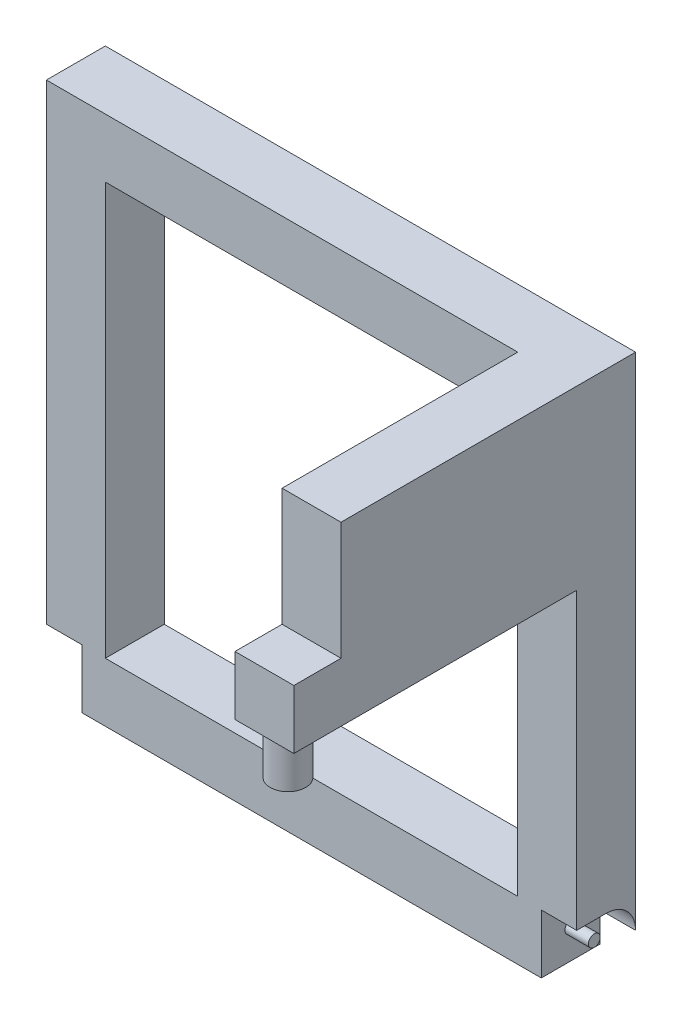
ISO-10303-21;
HEADER;
FILE_DESCRIPTION(('STEP AP214'),'2;1');
FILE_NAME('part.step','',(''),(''),'','','');
FILE_SCHEMA(('AUTOMOTIVE_DESIGN { 1 0 10303 214 1 1 1 1 }'));
ENDSEC;
DATA;
#1=APPLICATION_CONTEXT('core data for automotive mechanical design processes');
#2=APPLICATION_PROTOCOL_DEFINITION('international standard','automotive_design',2000,#1);
#3=PRODUCT_CONTEXT('',#1,'mechanical');
#4=PRODUCT('Part','Part','',(#3));
#5=PRODUCT_RELATED_PRODUCT_CATEGORY('part','',(#4));
#6=PRODUCT_DEFINITION_FORMATION('','',#4);
#7=PRODUCT_DEFINITION_CONTEXT('part definition',#1,'design');
#8=PRODUCT_DEFINITION('design','',#6,#7);
#9=PRODUCT_DEFINITION_SHAPE('','',#8);
#10=(LENGTH_UNIT() NAMED_UNIT(*) SI_UNIT(.MILLI.,.METRE.));
#11=(NAMED_UNIT(*) PLANE_ANGLE_UNIT() SI_UNIT($,.RADIAN.));
#12=(NAMED_UNIT(*) SI_UNIT($,.STERADIAN.) SOLID_ANGLE_UNIT());
#13=UNCERTAINTY_MEASURE_WITH_UNIT(LENGTH_MEASURE(1.E-05),#10,'distance_accuracy_value','');
#14=(GEOMETRIC_REPRESENTATION_CONTEXT(3) GLOBAL_UNCERTAINTY_ASSIGNED_CONTEXT((#13)) GLOBAL_UNIT_ASSIGNED_CONTEXT((#10,
#11,#12)) REPRESENTATION_CONTEXT('',''));
#15=CARTESIAN_POINT('',(0.,0.,0.));
#16=DIRECTION('',(0.,0.,1.));
#17=DIRECTION('',(1.,0.,0.));
#18=AXIS2_PLACEMENT_3D('',#15,#16,#17);
#19=CARTESIAN_POINT('',(0.,0.,25.));
#20=DIRECTION('',(0.,0.,-1.));
#21=DIRECTION('',(-1.,0.,0.));
#22=AXIS2_PLACEMENT_3D('',#19,#20,#21);
#23=PLANE('',#22);
#24=DIRECTION('',(-1.,0.,0.));
#25=VECTOR('',#24,1.);
#26=CARTESIAN_POINT('',(22.5,12.5,25.));
#27=LINE('',#26,#25);
#28=CARTESIAN_POINT('',(22.5,12.5,25.));
#29=VERTEX_POINT('',#28);
#30=CARTESIAN_POINT('',(17.5,12.5,25.));
#31=VERTEX_POINT('',#30);
#32=EDGE_CURVE('E48',#29,#31,#27,.T.);
#33=ORIENTED_EDGE('',*,*,#32,.F.);
#34=DIRECTION('',(0.,1.,0.));
#35=VECTOR('',#34,1.);
#36=CARTESIAN_POINT('',(22.5,22.5,25.));
#37=LINE('',#36,#35);
#38=CARTESIAN_POINT('',(22.5,22.5,25.));
#39=VERTEX_POINT('',#38);
#40=EDGE_CURVE('E187',#29,#39,#37,.T.);
#41=ORIENTED_EDGE('',*,*,#40,.T.);
#42=DIRECTION('',(-1.,0.,0.));
#43=VECTOR('',#42,1.);
#44=CARTESIAN_POINT('',(22.5,22.5,25.));
#45=LINE('',#44,#43);
#46=CARTESIAN_POINT('',(17.5,22.5,25.));
#47=VERTEX_POINT('',#46);
#48=EDGE_CURVE('E209',#39,#47,#45,.T.);
#49=ORIENTED_EDGE('',*,*,#48,.T.);
#50=DIRECTION('',(0.,-1.,0.));
#51=VECTOR('',#50,1.);
#52=CARTESIAN_POINT('',(17.5,22.5,25.));
#53=LINE('',#52,#51);
#54=EDGE_CURVE('E200',#47,#31,#53,.T.);
#55=ORIENTED_EDGE('',*,*,#54,.T.);
#56=EDGE_LOOP('',(#33,#41,#49,#55));
#57=FACE_BOUND('',#56,.T.);
#58=ADVANCED_FACE('F33',(#57),#23,.F.);
#59=CARTESIAN_POINT('',(-22.5,-22.5,5.));
#60=DIRECTION('',(0.,1.,0.));
#61=DIRECTION('',(0.,0.,1.));
#62=AXIS2_PLACEMENT_3D('',#59,#60,#61);
#63=PLANE('',#62);
#64=DIRECTION('',(0.,0.,1.));
#65=VECTOR('',#64,1.);
#66=CARTESIAN_POINT('',(19.5,-22.5,0.));
#67=LINE('',#66,#65);
#68=CARTESIAN_POINT('',(19.5,-22.5,0.));
#69=VERTEX_POINT('',#68);
#70=CARTESIAN_POINT('',(19.5,-22.5,5.));
#71=VERTEX_POINT('',#70);
#72=EDGE_CURVE('E246',#69,#71,#67,.T.);
#73=ORIENTED_EDGE('',*,*,#72,.T.);
#74=DIRECTION('',(1.,0.,0.));
#75=VECTOR('',#74,1.);
#76=CARTESIAN_POINT('',(-22.5,-22.5,5.));
#77=LINE('',#76,#75);
#78=CARTESIAN_POINT('',(-19.5,-22.5,5.));
#79=VERTEX_POINT('',#78);
#80=EDGE_CURVE('E316',#79,#71,#77,.T.);
#81=ORIENTED_EDGE('',*,*,#80,.F.);
#82=DIRECTION('',(0.,0.,1.));
#83=VECTOR('',#82,1.);
#84=CARTESIAN_POINT('',(-19.5,-22.5,0.));
#85=LINE('',#84,#83);
#86=CARTESIAN_POINT('',(-19.5,-22.5,0.));
#87=VERTEX_POINT('',#86);
#88=EDGE_CURVE('E269',#87,#79,#85,.T.);
#89=ORIENTED_EDGE('',*,*,#88,.F.);
#90=DIRECTION('',(1.,0.,0.));
#91=VECTOR('',#90,1.);
#92=CARTESIAN_POINT('',(-22.5,-22.5,0.));
#93=LINE('',#92,#91);
#94=EDGE_CURVE('E304',#87,#69,#93,.T.);
#95=ORIENTED_EDGE('',*,*,#94,.T.);
#96=EDGE_LOOP('',(#73,#81,#89,#95));
#97=FACE_BOUND('',#96,.T.);
#98=ADVANCED_FACE('F365',(#97),#63,.F.);
#99=CARTESIAN_POINT('',(0.,0.,5.));
#100=DIRECTION('',(0.,0.,1.));
#101=DIRECTION('',(1.,0.,0.));
#102=AXIS2_PLACEMENT_3D('',#99,#100,#101);
#103=PLANE('',#102);
#104=DIRECTION('',(1.,0.,0.));
#105=VECTOR('',#104,1.);
#106=CARTESIAN_POINT('',(22.5,7.5,5.));
#107=LINE('',#106,#105);
#108=CARTESIAN_POINT('',(17.5,7.5,5.));
#109=VERTEX_POINT('',#108);
#110=CARTESIAN_POINT('',(22.5,7.5,5.));
#111=VERTEX_POINT('',#110);
#112=EDGE_CURVE('E190',#109,#111,#107,.T.);
#113=ORIENTED_EDGE('',*,*,#112,.F.);
#114=DIRECTION('',(0.,1.,0.));
#115=VECTOR('',#114,1.);
#116=CARTESIAN_POINT('',(17.5,17.5,5.));
#117=LINE('',#116,#115);
#118=CARTESIAN_POINT('',(17.5,-17.5,5.));
#119=VERTEX_POINT('',#118);
#120=EDGE_CURVE('E292',#119,#109,#117,.T.);
#121=ORIENTED_EDGE('',*,*,#120,.F.);
#122=DIRECTION('',(1.,0.,0.));
#123=VECTOR('',#122,1.);
#124=CARTESIAN_POINT('',(-17.5,-17.5,5.));
#125=LINE('',#124,#123);
#126=CARTESIAN_POINT('',(-17.5,-17.5,5.));
#127=VERTEX_POINT('',#126);
#128=EDGE_CURVE('E414',#127,#119,#125,.T.);
#129=ORIENTED_EDGE('',*,*,#128,.F.);
#130=DIRECTION('',(0.,-1.,0.));
#131=VECTOR('',#130,1.);
#132=CARTESIAN_POINT('',(-17.5,17.5,5.));
#133=LINE('',#132,#131);
#134=CARTESIAN_POINT('',(-17.5,17.5,5.));
#135=VERTEX_POINT('',#134);
#136=EDGE_CURVE('E289',#135,#127,#133,.T.);
#137=ORIENTED_EDGE('',*,*,#136,.F.);
#138=DIRECTION('',(-1.,0.,0.));
#139=VECTOR('',#138,1.);
#140=CARTESIAN_POINT('',(-17.5,17.5,5.));
#141=LINE('',#140,#139);
#142=CARTESIAN_POINT('',(17.5,17.5,5.));
#143=VERTEX_POINT('',#142);
#144=EDGE_CURVE('E296',#143,#135,#141,.T.);
#145=ORIENTED_EDGE('',*,*,#144,.F.);
#146=DIRECTION('',(0.,-1.,0.));
#147=VECTOR('',#146,1.);
#148=CARTESIAN_POINT('',(17.5,22.5,5.));
#149=LINE('',#148,#147);
#150=CARTESIAN_POINT('',(17.5,22.5,5.));
#151=VERTEX_POINT('',#150);
#152=EDGE_CURVE('E188',#151,#143,#149,.T.);
#153=ORIENTED_EDGE('',*,*,#152,.F.);
#154=DIRECTION('',(-1.,0.,0.));
#155=VECTOR('',#154,1.);
#156=CARTESIAN_POINT('',(-22.5,22.5,5.));
#157=LINE('',#156,#155);
#158=CARTESIAN_POINT('',(-22.5,22.5,5.));
#159=VERTEX_POINT('',#158);
#160=EDGE_CURVE('E303',#151,#159,#157,.T.);
#161=ORIENTED_EDGE('',*,*,#160,.T.);
#162=DIRECTION('',(0.,-1.,0.));
#163=VECTOR('',#162,1.);
#164=CARTESIAN_POINT('',(-22.5,22.5,5.));
#165=LINE('',#164,#163);
#166=CARTESIAN_POINT('',(-22.5,-17.5,5.));
#167=VERTEX_POINT('',#166);
#168=EDGE_CURVE('E313',#159,#167,#165,.T.);
#169=ORIENTED_EDGE('',*,*,#168,.T.);
#170=DIRECTION('',(-1.,0.,0.));
#171=VECTOR('',#170,1.);
#172=CARTESIAN_POINT('',(-19.5,-17.5,5.));
#173=LINE('',#172,#171);
#174=CARTESIAN_POINT('',(-19.5,-17.5,5.));
#175=VERTEX_POINT('',#174);
#176=EDGE_CURVE('E283',#175,#167,#173,.T.);
#177=ORIENTED_EDGE('',*,*,#176,.F.);
#178=DIRECTION('',(0.,1.,0.));
#179=VECTOR('',#178,1.);
#180=CARTESIAN_POINT('',(-19.5,-22.5,5.));
#181=LINE('',#180,#179);
#182=EDGE_CURVE('E271',#79,#175,#181,.T.);
#183=ORIENTED_EDGE('',*,*,#182,.F.);
#184=ORIENTED_EDGE('',*,*,#80,.T.);
#185=DIRECTION('',(0.,1.,0.));
#186=VECTOR('',#185,1.);
#187=CARTESIAN_POINT('',(19.5,-22.5,5.));
#188=LINE('',#187,#186);
#189=CARTESIAN_POINT('',(19.5,-17.5,5.));
#190=VERTEX_POINT('',#189);
#191=EDGE_CURVE('E243',#71,#190,#188,.T.);
#192=ORIENTED_EDGE('',*,*,#191,.T.);
#193=DIRECTION('',(1.,0.,0.));
#194=VECTOR('',#193,1.);
#195=CARTESIAN_POINT('',(19.5,-17.5,5.));
#196=LINE('',#195,#194);
#197=CARTESIAN_POINT('',(22.5,-17.5,5.));
#198=VERTEX_POINT('',#197);
#199=EDGE_CURVE('E259',#190,#198,#196,.T.);
#200=ORIENTED_EDGE('',*,*,#199,.T.);
#201=DIRECTION('',(0.,1.,0.));
#202=VECTOR('',#201,1.);
#203=CARTESIAN_POINT('',(22.5,22.5,5.));
#204=LINE('',#203,#202);
#205=EDGE_CURVE('E299',#198,#111,#204,.T.);
#206=ORIENTED_EDGE('',*,*,#205,.T.);
#207=EDGE_LOOP('',(#113,#121,#129,#137,#145,#153,#161,#169,#177,#183,#184,#192,#200,#206));
#208=FACE_BOUND('',#207,.T.);
#209=ADVANCED_FACE('F361',(#208),#103,.T.);
#210=CARTESIAN_POINT('',(22.5,22.5,5.));
#211=DIRECTION('',(-1.,0.,0.));
#212=DIRECTION('',(0.,-1.,0.));
#213=AXIS2_PLACEMENT_3D('',#210,#211,#212);
#214=PLANE('',#213);
#215=CARTESIAN_POINT('',(22.5,-20.,2.5));
#216=DIRECTION('',(-1.,0.,0.));
#217=DIRECTION('',(0.,-1.,0.));
#218=AXIS2_PLACEMENT_3D('',#215,#216,#217);
#219=CIRCLE('',#218,2.5);
#220=CARTESIAN_POINT('',(22.5,-17.5,2.5));
#221=VERTEX_POINT('',#220);
#222=CARTESIAN_POINT('',(22.5,-20.,0.));
#223=VERTEX_POINT('',#222);
#224=EDGE_CURVE('E56',#221,#223,#219,.T.);
#225=ORIENTED_EDGE('',*,*,#224,.T.);
#226=DIRECTION('',(0.,1.,0.));
#227=VECTOR('',#226,1.);
#228=CARTESIAN_POINT('',(22.5,22.5,0.));
#229=LINE('',#228,#227);
#230=CARTESIAN_POINT('',(22.5,22.5,0.));
#231=VERTEX_POINT('',#230);
#232=EDGE_CURVE('E320',#223,#231,#229,.T.);
#233=ORIENTED_EDGE('',*,*,#232,.T.);
#234=DIRECTION('',(0.,0.,-1.));
#235=VECTOR('',#234,1.);
#236=CARTESIAN_POINT('',(22.5,22.5,5.));
#237=LINE('',#236,#235);
#238=EDGE_CURVE('E331',#39,#231,#237,.T.);
#239=ORIENTED_EDGE('',*,*,#238,.F.);
#240=ORIENTED_EDGE('',*,*,#40,.F.);
#241=DIRECTION('',(0.,0.,-1.));
#242=VECTOR('',#241,1.);
#243=CARTESIAN_POINT('',(22.5,12.5,29.));
#244=LINE('',#243,#242);
#245=CARTESIAN_POINT('',(22.5,12.5,29.));
#246=VERTEX_POINT('',#245);
#247=EDGE_CURVE('E169',#246,#29,#244,.T.);
#248=ORIENTED_EDGE('',*,*,#247,.F.);
#249=DIRECTION('',(0.,1.,0.));
#250=VECTOR('',#249,1.);
#251=CARTESIAN_POINT('',(22.5,7.5,29.));
#252=LINE('',#251,#250);
#253=CARTESIAN_POINT('',(22.5,7.5,29.));
#254=VERTEX_POINT('',#253);
#255=EDGE_CURVE('E176',#254,#246,#252,.T.);
#256=ORIENTED_EDGE('',*,*,#255,.F.);
#257=DIRECTION('',(0.,0.,-1.));
#258=VECTOR('',#257,1.);
#259=CARTESIAN_POINT('',(22.5,7.5,25.));
#260=LINE('',#259,#258);
#261=EDGE_CURVE('E219',#254,#111,#260,.T.);
#262=ORIENTED_EDGE('',*,*,#261,.T.);
#263=ORIENTED_EDGE('',*,*,#205,.F.);
#264=DIRECTION('',(0.,0.,-1.));
#265=VECTOR('',#264,1.);
#266=CARTESIAN_POINT('',(22.5,-17.5,2.5));
#267=LINE('',#266,#265);
#268=EDGE_CURVE('E241',#198,#221,#267,.T.);
#269=ORIENTED_EDGE('',*,*,#268,.T.);
#270=EDGE_LOOP('',(#225,#233,#239,#240,#248,#256,#262,#263,#269));
#271=FACE_BOUND('',#270,.T.);
#272=ADVANCED_FACE('F35',(#271),#214,.F.);
#273=CARTESIAN_POINT('',(0.,0.,0.));
#274=DIRECTION('',(0.,0.,1.));
#275=DIRECTION('',(1.,0.,0.));
#276=AXIS2_PLACEMENT_3D('',#273,#274,#275);
#277=PLANE('',#276);
#278=ORIENTED_EDGE('',*,*,#232,.F.);
#279=DIRECTION('',(1.,0.,0.));
#280=VECTOR('',#279,1.);
#281=CARTESIAN_POINT('',(19.5,-20.,0.));
#282=LINE('',#281,#280);
#283=CARTESIAN_POINT('',(19.5,-20.,0.));
#284=VERTEX_POINT('',#283);
#285=EDGE_CURVE('E256',#284,#223,#282,.T.);
#286=ORIENTED_EDGE('',*,*,#285,.F.);
#287=DIRECTION('',(0.,-1.,0.));
#288=VECTOR('',#287,1.);
#289=CARTESIAN_POINT('',(19.5,-20.,0.));
#290=LINE('',#289,#288);
#291=EDGE_CURVE('E249',#284,#69,#290,.T.);
#292=ORIENTED_EDGE('',*,*,#291,.T.);
#293=ORIENTED_EDGE('',*,*,#94,.F.);
#294=DIRECTION('',(0.,-1.,0.));
#295=VECTOR('',#294,1.);
#296=CARTESIAN_POINT('',(-19.5,-20.,0.));
#297=LINE('',#296,#295);
#298=CARTESIAN_POINT('',(-19.5,-20.,0.));
#299=VERTEX_POINT('',#298);
#300=EDGE_CURVE('E266',#299,#87,#297,.T.);
#301=ORIENTED_EDGE('',*,*,#300,.F.);
#302=DIRECTION('',(-1.,0.,0.));
#303=VECTOR('',#302,1.);
#304=CARTESIAN_POINT('',(-19.5,-20.,0.));
#305=LINE('',#304,#303);
#306=CARTESIAN_POINT('',(-22.5,-20.,0.));
#307=VERTEX_POINT('',#306);
#308=EDGE_CURVE('E276',#299,#307,#305,.T.);
#309=ORIENTED_EDGE('',*,*,#308,.T.);
#310=DIRECTION('',(0.,-1.,0.));
#311=VECTOR('',#310,1.);
#312=CARTESIAN_POINT('',(-22.5,22.5,0.));
#313=LINE('',#312,#311);
#314=CARTESIAN_POINT('',(-22.5,22.5,0.));
#315=VERTEX_POINT('',#314);
#316=EDGE_CURVE('E325',#315,#307,#313,.T.);
#317=ORIENTED_EDGE('',*,*,#316,.F.);
#318=DIRECTION('',(-1.,0.,0.));
#319=VECTOR('',#318,1.);
#320=CARTESIAN_POINT('',(-22.5,22.5,0.));
#321=LINE('',#320,#319);
#322=EDGE_CURVE('E322',#231,#315,#321,.T.);
#323=ORIENTED_EDGE('',*,*,#322,.F.);
#324=EDGE_LOOP('',(#278,#286,#292,#293,#301,#309,#317,#323));
#325=FACE_BOUND('',#324,.T.);
#326=DIRECTION('',(0.,1.,0.));
#327=VECTOR('',#326,1.);
#328=CARTESIAN_POINT('',(17.5,17.5,0.));
#329=LINE('',#328,#327);
#330=CARTESIAN_POINT('',(17.5,-17.5,0.));
#331=VERTEX_POINT('',#330);
#332=CARTESIAN_POINT('',(17.5,17.5,0.));
#333=VERTEX_POINT('',#332);
#334=EDGE_CURVE('E282',#331,#333,#329,.T.);
#335=ORIENTED_EDGE('',*,*,#334,.T.);
#336=DIRECTION('',(-1.,0.,0.));
#337=VECTOR('',#336,1.);
#338=CARTESIAN_POINT('',(-17.5,17.5,0.));
#339=LINE('',#338,#337);
#340=CARTESIAN_POINT('',(-17.5,17.5,0.));
#341=VERTEX_POINT('',#340);
#342=EDGE_CURVE('E397',#333,#341,#339,.T.);
#343=ORIENTED_EDGE('',*,*,#342,.T.);
#344=DIRECTION('',(0.,-1.,0.));
#345=VECTOR('',#344,1.);
#346=CARTESIAN_POINT('',(-17.5,17.5,0.));
#347=LINE('',#346,#345);
#348=CARTESIAN_POINT('',(-17.5,-17.5,0.));
#349=VERTEX_POINT('',#348);
#350=EDGE_CURVE('E418',#341,#349,#347,.T.);
#351=ORIENTED_EDGE('',*,*,#350,.T.);
#352=DIRECTION('',(1.,0.,0.));
#353=VECTOR('',#352,1.);
#354=CARTESIAN_POINT('',(-17.5,-17.5,0.));
#355=LINE('',#354,#353);
#356=EDGE_CURVE('E297',#349,#331,#355,.T.);
#357=ORIENTED_EDGE('',*,*,#356,.T.);
#358=EDGE_LOOP('',(#335,#343,#351,#357));
#359=FACE_BOUND('',#358,.T.);
#360=ADVANCED_FACE('F352',(#325,#359),#277,.F.);
#361=CARTESIAN_POINT('',(-22.5,22.5,5.));
#362=DIRECTION('',(0.,-1.,0.));
#363=DIRECTION('',(0.,0.,-1.));
#364=AXIS2_PLACEMENT_3D('',#361,#362,#363);
#365=PLANE('',#364);
#366=ORIENTED_EDGE('',*,*,#322,.T.);
#367=DIRECTION('',(0.,0.,-1.));
#368=VECTOR('',#367,1.);
#369=CARTESIAN_POINT('',(-22.5,22.5,5.));
#370=LINE('',#369,#368);
#371=EDGE_CURVE('E319',#159,#315,#370,.T.);
#372=ORIENTED_EDGE('',*,*,#371,.F.);
#373=ORIENTED_EDGE('',*,*,#160,.F.);
#374=DIRECTION('',(0.,0.,-1.));
#375=VECTOR('',#374,1.);
#376=CARTESIAN_POINT('',(17.5,22.5,25.));
#377=LINE('',#376,#375);
#378=EDGE_CURVE('E213',#47,#151,#377,.T.);
#379=ORIENTED_EDGE('',*,*,#378,.F.);
#380=ORIENTED_EDGE('',*,*,#48,.F.);
#381=ORIENTED_EDGE('',*,*,#238,.T.);
#382=EDGE_LOOP('',(#366,#372,#373,#379,#380,#381));
#383=FACE_BOUND('',#382,.T.);
#384=ADVANCED_FACE('F381',(#383),#365,.F.);
#385=CARTESIAN_POINT('',(-22.5,22.5,5.));
#386=DIRECTION('',(1.,0.,0.));
#387=DIRECTION('',(0.,1.,0.));
#388=AXIS2_PLACEMENT_3D('',#385,#386,#387);
#389=PLANE('',#388);
#390=ORIENTED_EDGE('',*,*,#316,.T.);
#391=CARTESIAN_POINT('',(-22.5,-20.,2.5));
#392=DIRECTION('',(-1.,0.,0.));
#393=DIRECTION('',(0.,-1.,0.));
#394=AXIS2_PLACEMENT_3D('',#391,#392,#393);
#395=CIRCLE('',#394,2.5);
#396=CARTESIAN_POINT('',(-22.5,-17.5,2.5));
#397=VERTEX_POINT('',#396);
#398=EDGE_CURVE('E258',#397,#307,#395,.T.);
#399=ORIENTED_EDGE('',*,*,#398,.F.);
#400=DIRECTION('',(0.,0.,-1.));
#401=VECTOR('',#400,1.);
#402=CARTESIAN_POINT('',(-22.5,-17.5,2.5));
#403=LINE('',#402,#401);
#404=EDGE_CURVE('E267',#167,#397,#403,.T.);
#405=ORIENTED_EDGE('',*,*,#404,.F.);
#406=ORIENTED_EDGE('',*,*,#168,.F.);
#407=ORIENTED_EDGE('',*,*,#371,.T.);
#408=EDGE_LOOP('',(#390,#399,#405,#406,#407));
#409=FACE_BOUND('',#408,.T.);
#410=ADVANCED_FACE('F377',(#409),#389,.F.);
#411=CARTESIAN_POINT('',(17.5,17.5,5.));
#412=DIRECTION('',(-1.,0.,0.));
#413=DIRECTION('',(0.,0.,1.));
#414=AXIS2_PLACEMENT_3D('',#411,#412,#413);
#415=PLANE('',#414);
#416=ORIENTED_EDGE('',*,*,#334,.F.);
#417=DIRECTION('',(0.,0.,-1.));
#418=VECTOR('',#417,1.);
#419=CARTESIAN_POINT('',(17.5,-17.5,5.));
#420=LINE('',#419,#418);
#421=EDGE_CURVE('E410',#119,#331,#420,.T.);
#422=ORIENTED_EDGE('',*,*,#421,.F.);
#423=ORIENTED_EDGE('',*,*,#120,.T.);
#424=DIRECTION('',(0.,0.,-1.));
#425=VECTOR('',#424,1.);
#426=CARTESIAN_POINT('',(17.5,7.5,25.));
#427=LINE('',#426,#425);
#428=CARTESIAN_POINT('',(17.5,7.5,29.));
#429=VERTEX_POINT('',#428);
#430=EDGE_CURVE('E216',#429,#109,#427,.T.);
#431=ORIENTED_EDGE('',*,*,#430,.F.);
#432=DIRECTION('',(0.,-1.,0.));
#433=VECTOR('',#432,1.);
#434=CARTESIAN_POINT('',(17.5,7.5,29.));
#435=LINE('',#434,#433);
#436=CARTESIAN_POINT('',(17.5,12.5,29.));
#437=VERTEX_POINT('',#436);
#438=EDGE_CURVE('E175',#437,#429,#435,.T.);
#439=ORIENTED_EDGE('',*,*,#438,.F.);
#440=DIRECTION('',(0.,0.,-1.));
#441=VECTOR('',#440,1.);
#442=CARTESIAN_POINT('',(17.5,12.5,29.));
#443=LINE('',#442,#441);
#444=EDGE_CURVE('E171',#437,#31,#443,.T.);
#445=ORIENTED_EDGE('',*,*,#444,.T.);
#446=ORIENTED_EDGE('',*,*,#54,.F.);
#447=ORIENTED_EDGE('',*,*,#378,.T.);
#448=ORIENTED_EDGE('',*,*,#152,.T.);
#449=DIRECTION('',(0.,0.,-1.));
#450=VECTOR('',#449,1.);
#451=CARTESIAN_POINT('',(17.5,17.5,5.));
#452=LINE('',#451,#450);
#453=EDGE_CURVE('E323',#143,#333,#452,.T.);
#454=ORIENTED_EDGE('',*,*,#453,.T.);
#455=EDGE_LOOP('',(#416,#422,#423,#431,#439,#445,#446,#447,#448,#454));
#456=FACE_BOUND('',#455,.T.);
#457=ADVANCED_FACE('F391',(#456),#415,.T.);
#458=CARTESIAN_POINT('',(-17.5,17.5,5.));
#459=DIRECTION('',(0.,-1.,0.));
#460=DIRECTION('',(0.,0.,-1.));
#461=AXIS2_PLACEMENT_3D('',#458,#459,#460);
#462=PLANE('',#461);
#463=ORIENTED_EDGE('',*,*,#342,.F.);
#464=ORIENTED_EDGE('',*,*,#453,.F.);
#465=ORIENTED_EDGE('',*,*,#144,.T.);
#466=DIRECTION('',(0.,0.,-1.));
#467=VECTOR('',#466,1.);
#468=CARTESIAN_POINT('',(-17.5,17.5,5.));
#469=LINE('',#468,#467);
#470=EDGE_CURVE('E309',#135,#341,#469,.T.);
#471=ORIENTED_EDGE('',*,*,#470,.T.);
#472=EDGE_LOOP('',(#463,#464,#465,#471));
#473=FACE_BOUND('',#472,.T.);
#474=ADVANCED_FACE('F394',(#473),#462,.T.);
#475=CARTESIAN_POINT('',(-17.5,17.5,5.));
#476=DIRECTION('',(1.,0.,0.));
#477=DIRECTION('',(0.,0.,-1.));
#478=AXIS2_PLACEMENT_3D('',#475,#476,#477);
#479=PLANE('',#478);
#480=ORIENTED_EDGE('',*,*,#350,.F.);
#481=ORIENTED_EDGE('',*,*,#470,.F.);
#482=ORIENTED_EDGE('',*,*,#136,.T.);
#483=DIRECTION('',(0.,0.,-1.));
#484=VECTOR('',#483,1.);
#485=CARTESIAN_POINT('',(-17.5,-17.5,5.));
#486=LINE('',#485,#484);
#487=EDGE_CURVE('E398',#127,#349,#486,.T.);
#488=ORIENTED_EDGE('',*,*,#487,.T.);
#489=EDGE_LOOP('',(#480,#481,#482,#488));
#490=FACE_BOUND('',#489,.T.);
#491=ADVANCED_FACE('F426',(#490),#479,.T.);
#492=CARTESIAN_POINT('',(-17.5,-17.5,5.));
#493=DIRECTION('',(0.,1.,0.));
#494=DIRECTION('',(-1.,0.,0.));
#495=AXIS2_PLACEMENT_3D('',#492,#493,#494);
#496=PLANE('',#495);
#497=ORIENTED_EDGE('',*,*,#356,.F.);
#498=ORIENTED_EDGE('',*,*,#487,.F.);
#499=ORIENTED_EDGE('',*,*,#128,.T.);
#500=ORIENTED_EDGE('',*,*,#421,.T.);
#501=EDGE_LOOP('',(#497,#498,#499,#500));
#502=FACE_BOUND('',#501,.T.);
#503=ADVANCED_FACE('F423',(#502),#496,.T.);
#504=CARTESIAN_POINT('',(-19.5,-20.,2.5));
#505=DIRECTION('',(-1.,0.,0.));
#506=DIRECTION('',(0.,-1.,0.));
#507=AXIS2_PLACEMENT_3D('',#504,#505,#506);
#508=CYLINDRICAL_SURFACE('',#507,2.5);
#509=ORIENTED_EDGE('',*,*,#398,.T.);
#510=ORIENTED_EDGE('',*,*,#308,.F.);
#511=CARTESIAN_POINT('',(-19.5,-20.,2.5));
#512=DIRECTION('',(-1.,0.,0.));
#513=DIRECTION('',(0.,-1.,0.));
#514=AXIS2_PLACEMENT_3D('',#511,#512,#513);
#515=CIRCLE('',#514,2.5);
#516=CARTESIAN_POINT('',(-19.5,-17.5,2.5));
#517=VERTEX_POINT('',#516);
#518=EDGE_CURVE('E263',#517,#299,#515,.T.);
#519=ORIENTED_EDGE('',*,*,#518,.F.);
#520=DIRECTION('',(-1.,0.,0.));
#521=VECTOR('',#520,1.);
#522=CARTESIAN_POINT('',(-19.5,-17.5,2.5));
#523=LINE('',#522,#521);
#524=EDGE_CURVE('E280',#517,#397,#523,.T.);
#525=ORIENTED_EDGE('',*,*,#524,.T.);
#526=EDGE_LOOP('',(#509,#510,#519,#525));
#527=FACE_BOUND('',#526,.T.);
#528=ADVANCED_FACE('F373',(#527),#508,.F.);
#529=CARTESIAN_POINT('',(-19.5,-17.5,2.5));
#530=DIRECTION('',(0.,1.,0.));
#531=DIRECTION('',(0.,0.,1.));
#532=AXIS2_PLACEMENT_3D('',#529,#530,#531);
#533=PLANE('',#532);
#534=ORIENTED_EDGE('',*,*,#404,.T.);
#535=ORIENTED_EDGE('',*,*,#524,.F.);
#536=DIRECTION('',(0.,0.,-1.));
#537=VECTOR('',#536,1.);
#538=CARTESIAN_POINT('',(-19.5,-17.5,2.5));
#539=LINE('',#538,#537);
#540=EDGE_CURVE('E273',#175,#517,#539,.T.);
#541=ORIENTED_EDGE('',*,*,#540,.F.);
#542=ORIENTED_EDGE('',*,*,#176,.T.);
#543=EDGE_LOOP('',(#534,#535,#541,#542));
#544=FACE_BOUND('',#543,.T.);
#545=ADVANCED_FACE('F469',(#544),#533,.F.);
#546=CARTESIAN_POINT('',(-19.5,-20.,2.5));
#547=DIRECTION('',(-1.,0.,0.));
#548=DIRECTION('',(0.,-1.,0.));
#549=AXIS2_PLACEMENT_3D('',#546,#547,#548);
#550=PLANE('',#549);
#551=CARTESIAN_POINT('',(-19.5,-20.,2.5));
#552=DIRECTION('',(-1.,0.,0.));
#553=DIRECTION('',(0.,-1.,0.));
#554=AXIS2_PLACEMENT_3D('',#551,#552,#553);
#555=CIRCLE('',#554,0.5);
#556=CARTESIAN_POINT('',(-19.5,-20.5,2.5));
#557=VERTEX_POINT('',#556);
#558=EDGE_CURVE('E231',#557,#557,#555,.T.);
#559=ORIENTED_EDGE('',*,*,#558,.F.);
#560=EDGE_LOOP('',(#559));
#561=FACE_BOUND('',#560,.T.);
#562=ORIENTED_EDGE('',*,*,#518,.T.);
#563=ORIENTED_EDGE('',*,*,#300,.T.);
#564=ORIENTED_EDGE('',*,*,#88,.T.);
#565=ORIENTED_EDGE('',*,*,#182,.T.);
#566=ORIENTED_EDGE('',*,*,#540,.T.);
#567=EDGE_LOOP('',(#562,#563,#564,#565,#566));
#568=FACE_BOUND('',#567,.T.);
#569=ADVANCED_FACE('F369',(#561,#568),#550,.T.);
#570=CARTESIAN_POINT('',(19.5,-20.,2.5));
#571=DIRECTION('',(1.,0.,0.));
#572=DIRECTION('',(0.,1.,0.));
#573=AXIS2_PLACEMENT_3D('',#570,#571,#572);
#574=CYLINDRICAL_SURFACE('',#573,2.5);
#575=ORIENTED_EDGE('',*,*,#224,.F.);
#576=DIRECTION('',(1.,0.,0.));
#577=VECTOR('',#576,1.);
#578=CARTESIAN_POINT('',(19.5,-17.5,2.5));
#579=LINE('',#578,#577);
#580=CARTESIAN_POINT('',(19.5,-17.5,2.5));
#581=VERTEX_POINT('',#580);
#582=EDGE_CURVE('E252',#581,#221,#579,.T.);
#583=ORIENTED_EDGE('',*,*,#582,.F.);
#584=CARTESIAN_POINT('',(19.5,-20.,2.5));
#585=DIRECTION('',(-1.,0.,0.));
#586=DIRECTION('',(0.,-1.,0.));
#587=AXIS2_PLACEMENT_3D('',#584,#585,#586);
#588=CIRCLE('',#587,2.5);
#589=EDGE_CURVE('E237',#581,#284,#588,.T.);
#590=ORIENTED_EDGE('',*,*,#589,.T.);
#591=ORIENTED_EDGE('',*,*,#285,.T.);
#592=EDGE_LOOP('',(#575,#583,#590,#591));
#593=FACE_BOUND('',#592,.T.);
#594=ADVANCED_FACE('F349',(#593),#574,.F.);
#595=CARTESIAN_POINT('',(19.5,-17.5,2.5));
#596=DIRECTION('',(0.,-1.,0.));
#597=DIRECTION('',(0.,0.,-1.));
#598=AXIS2_PLACEMENT_3D('',#595,#596,#597);
#599=PLANE('',#598);
#600=ORIENTED_EDGE('',*,*,#268,.F.);
#601=ORIENTED_EDGE('',*,*,#199,.F.);
#602=DIRECTION('',(0.,0.,-1.));
#603=VECTOR('',#602,1.);
#604=CARTESIAN_POINT('',(19.5,-17.5,2.5));
#605=LINE('',#604,#603);
#606=EDGE_CURVE('E240',#190,#581,#605,.T.);
#607=ORIENTED_EDGE('',*,*,#606,.T.);
#608=ORIENTED_EDGE('',*,*,#582,.T.);
#609=EDGE_LOOP('',(#600,#601,#607,#608));
#610=FACE_BOUND('',#609,.T.);
#611=ADVANCED_FACE('F344',(#610),#599,.T.);
#612=CARTESIAN_POINT('',(19.5,-20.,2.5));
#613=DIRECTION('',(1.,0.,0.));
#614=DIRECTION('',(0.,-1.,0.));
#615=AXIS2_PLACEMENT_3D('',#612,#613,#614);
#616=PLANE('',#615);
#617=CARTESIAN_POINT('',(19.5,-20.,2.5));
#618=DIRECTION('',(1.,0.,0.));
#619=DIRECTION('',(0.,1.,0.));
#620=AXIS2_PLACEMENT_3D('',#617,#618,#619);
#621=CIRCLE('',#620,0.5);
#622=CARTESIAN_POINT('',(19.5,-19.5,2.5));
#623=VERTEX_POINT('',#622);
#624=EDGE_CURVE('E41',#623,#623,#621,.T.);
#625=ORIENTED_EDGE('',*,*,#624,.F.);
#626=EDGE_LOOP('',(#625));
#627=FACE_BOUND('',#626,.T.);
#628=ORIENTED_EDGE('',*,*,#589,.F.);
#629=ORIENTED_EDGE('',*,*,#606,.F.);
#630=ORIENTED_EDGE('',*,*,#191,.F.);
#631=ORIENTED_EDGE('',*,*,#72,.F.);
#632=ORIENTED_EDGE('',*,*,#291,.F.);
#633=EDGE_LOOP('',(#628,#629,#630,#631,#632));
#634=FACE_BOUND('',#633,.T.);
#635=ADVANCED_FACE('F340',(#627,#634),#616,.T.);
#636=CARTESIAN_POINT('',(-21.5,-20.,2.5));
#637=DIRECTION('',(1.,0.,0.));
#638=DIRECTION('',(0.,1.,0.));
#639=AXIS2_PLACEMENT_3D('',#636,#637,#638);
#640=CYLINDRICAL_SURFACE('',#639,0.5);
#641=CARTESIAN_POINT('',(-21.5,-20.,2.5));
#642=DIRECTION('',(-1.,0.,0.));
#643=DIRECTION('',(0.,-1.,0.));
#644=AXIS2_PLACEMENT_3D('',#641,#642,#643);
#645=CIRCLE('',#644,0.5);
#646=CARTESIAN_POINT('',(-21.5,-20.5,2.5));
#647=VERTEX_POINT('',#646);
#648=EDGE_CURVE('E232',#647,#647,#645,.T.);
#649=ORIENTED_EDGE('',*,*,#648,.F.);
#650=EDGE_LOOP('',(#649));
#651=FACE_BOUND('',#650,.T.);
#652=ORIENTED_EDGE('',*,*,#558,.T.);
#653=EDGE_LOOP('',(#652));
#654=FACE_BOUND('',#653,.T.);
#655=ADVANCED_FACE('F343',(#651,#654),#640,.T.);
#656=CARTESIAN_POINT('',(-21.5,-20.,2.5));
#657=DIRECTION('',(-1.,0.,0.));
#658=DIRECTION('',(0.,-1.,0.));
#659=AXIS2_PLACEMENT_3D('',#656,#657,#658);
#660=PLANE('',#659);
#661=ORIENTED_EDGE('',*,*,#648,.T.);
#662=EDGE_LOOP('',(#661));
#663=FACE_BOUND('',#662,.T.);
#664=ADVANCED_FACE('F455',(#663),#660,.T.);
#665=CARTESIAN_POINT('',(21.5,-20.,2.5));
#666=DIRECTION('',(-1.,0.,0.));
#667=DIRECTION('',(0.,-1.,0.));
#668=AXIS2_PLACEMENT_3D('',#665,#666,#667);
#669=CYLINDRICAL_SURFACE('',#668,0.5);
#670=CARTESIAN_POINT('',(21.5,-20.,2.5));
#671=DIRECTION('',(-1.,0.,0.));
#672=DIRECTION('',(0.,-1.,0.));
#673=AXIS2_PLACEMENT_3D('',#670,#671,#672);
#674=CIRCLE('',#673,0.5);
#675=CARTESIAN_POINT('',(21.5,-20.5,2.5));
#676=VERTEX_POINT('',#675);
#677=EDGE_CURVE('E215',#676,#676,#674,.T.);
#678=ORIENTED_EDGE('',*,*,#677,.T.);
#679=EDGE_LOOP('',(#678));
#680=FACE_BOUND('',#679,.T.);
#681=ORIENTED_EDGE('',*,*,#624,.T.);
#682=EDGE_LOOP('',(#681));
#683=FACE_BOUND('',#682,.T.);
#684=ADVANCED_FACE('F338',(#680,#683),#669,.T.);
#685=CARTESIAN_POINT('',(21.5,-20.,2.5));
#686=DIRECTION('',(1.,0.,0.));
#687=DIRECTION('',(0.,-1.,0.));
#688=AXIS2_PLACEMENT_3D('',#685,#686,#687);
#689=PLANE('',#688);
#690=ORIENTED_EDGE('',*,*,#677,.F.);
#691=EDGE_LOOP('',(#690));
#692=FACE_BOUND('',#691,.T.);
#693=ADVANCED_FACE('F448',(#692),#689,.T.);
#694=CARTESIAN_POINT('',(22.5,7.5,25.));
#695=DIRECTION('',(0.,1.,0.));
#696=DIRECTION('',(0.,0.,1.));
#697=AXIS2_PLACEMENT_3D('',#694,#695,#696);
#698=PLANE('',#697);
#699=CARTESIAN_POINT('',(20.,7.5,27.));
#700=DIRECTION('',(0.,1.,0.));
#701=DIRECTION('',(0.,0.,1.));
#702=AXIS2_PLACEMENT_3D('',#699,#700,#701);
#703=CIRCLE('',#702,1.5);
#704=CARTESIAN_POINT('',(20.,7.5,28.5));
#705=VERTEX_POINT('',#704);
#706=EDGE_CURVE('E11',#705,#705,#703,.F.);
#707=ORIENTED_EDGE('',*,*,#706,.F.);
#708=EDGE_LOOP('',(#707));
#709=FACE_BOUND('',#708,.T.);
#710=ORIENTED_EDGE('',*,*,#112,.T.);
#711=ORIENTED_EDGE('',*,*,#261,.F.);
#712=DIRECTION('',(1.,0.,0.));
#713=VECTOR('',#712,1.);
#714=CARTESIAN_POINT('',(22.5,7.5,29.));
#715=LINE('',#714,#713);
#716=EDGE_CURVE('E182',#429,#254,#715,.T.);
#717=ORIENTED_EDGE('',*,*,#716,.F.);
#718=ORIENTED_EDGE('',*,*,#430,.T.);
#719=EDGE_LOOP('',(#710,#711,#717,#718));
#720=FACE_BOUND('',#719,.T.);
#721=ADVANCED_FACE('F405',(#709,#720),#698,.F.);
#722=CARTESIAN_POINT('',(22.5,12.5,29.));
#723=DIRECTION('',(0.,-1.,0.));
#724=DIRECTION('',(0.,0.,-1.));
#725=AXIS2_PLACEMENT_3D('',#722,#723,#724);
#726=PLANE('',#725);
#727=ORIENTED_EDGE('',*,*,#32,.T.);
#728=ORIENTED_EDGE('',*,*,#444,.F.);
#729=DIRECTION('',(-1.,0.,0.));
#730=VECTOR('',#729,1.);
#731=CARTESIAN_POINT('',(22.5,12.5,29.));
#732=LINE('',#731,#730);
#733=EDGE_CURVE('E165',#246,#437,#732,.T.);
#734=ORIENTED_EDGE('',*,*,#733,.F.);
#735=ORIENTED_EDGE('',*,*,#247,.T.);
#736=EDGE_LOOP('',(#727,#728,#734,#735));
#737=FACE_BOUND('',#736,.T.);
#738=ADVANCED_FACE('F167',(#737),#726,.F.);
#739=CARTESIAN_POINT('',(0.,0.,29.));
#740=DIRECTION('',(0.,0.,1.));
#741=DIRECTION('',(1.,0.,0.));
#742=AXIS2_PLACEMENT_3D('',#739,#740,#741);
#743=PLANE('',#742);
#744=ORIENTED_EDGE('',*,*,#255,.T.);
#745=ORIENTED_EDGE('',*,*,#733,.T.);
#746=ORIENTED_EDGE('',*,*,#438,.T.);
#747=ORIENTED_EDGE('',*,*,#716,.T.);
#748=EDGE_LOOP('',(#744,#745,#746,#747));
#749=FACE_BOUND('',#748,.T.);
#750=ADVANCED_FACE('F180',(#749),#743,.T.);
#751=CARTESIAN_POINT('',(20.,3.5,27.));
#752=DIRECTION('',(0.,1.,0.));
#753=DIRECTION('',(0.,0.,1.));
#754=AXIS2_PLACEMENT_3D('',#751,#752,#753);
#755=CYLINDRICAL_SURFACE('',#754,1.5);
#756=CARTESIAN_POINT('',(20.,3.5,27.));
#757=DIRECTION('',(0.,-1.,0.));
#758=DIRECTION('',(0.,0.,-1.));
#759=AXIS2_PLACEMENT_3D('',#756,#757,#758);
#760=CIRCLE('',#759,1.5);
#761=CARTESIAN_POINT('',(20.,3.5,25.5));
#762=VERTEX_POINT('',#761);
#763=EDGE_CURVE('E199',#762,#762,#760,.T.);
#764=ORIENTED_EDGE('',*,*,#763,.F.);
#765=EDGE_LOOP('',(#764));
#766=FACE_BOUND('',#765,.T.);
#767=ORIENTED_EDGE('',*,*,#706,.T.);
#768=EDGE_LOOP('',(#767));
#769=FACE_BOUND('',#768,.T.);
#770=ADVANCED_FACE('F555',(#766,#769),#755,.T.);
#771=CARTESIAN_POINT('',(20.,3.5,27.));
#772=DIRECTION('',(0.,-1.,0.));
#773=DIRECTION('',(0.,0.,-1.));
#774=AXIS2_PLACEMENT_3D('',#771,#772,#773);
#775=PLANE('',#774);
#776=ORIENTED_EDGE('',*,*,#763,.T.);
#777=EDGE_LOOP('',(#776));
#778=FACE_BOUND('',#777,.T.);
#779=ADVANCED_FACE('F560',(#778),#775,.T.);
#780=CLOSED_SHELL('',(#58,#98,#209,#272,#360,#384,#410,#457,#474,#491,#503,#528,#545,#569,#594,
#611,#635,#655,#664,#684,#693,#721,#738,#750,#770,#779));
#781=MANIFOLD_SOLID_BREP('B2',#780);
#782=ADVANCED_BREP_SHAPE_REPRESENTATION('',(#18,#781),#14);
#783=SHAPE_DEFINITION_REPRESENTATION(#9,#782);
ENDSEC;
END-ISO-10303-21;
